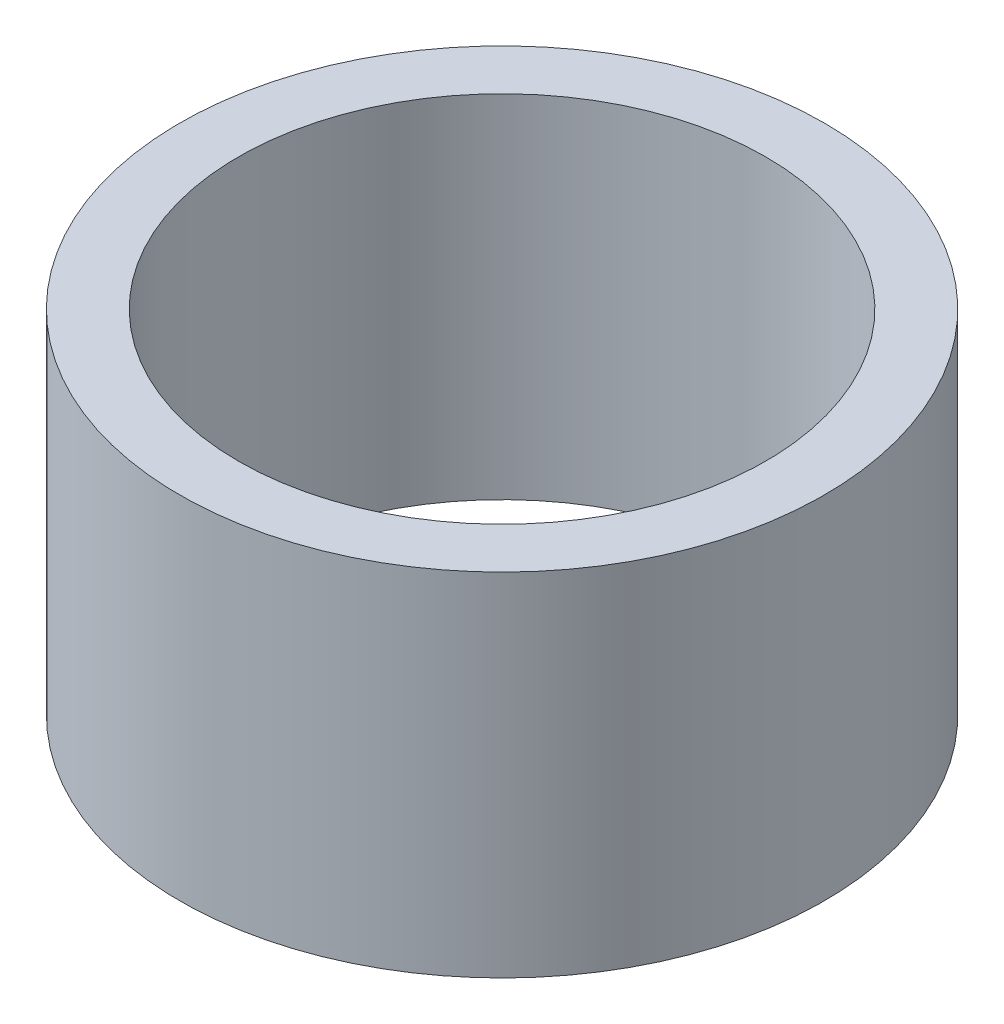
ISO-10303-21;
HEADER;
FILE_DESCRIPTION(('STEP AP214'),'2;1');
FILE_NAME('part.step','',(''),(''),'','','');
FILE_SCHEMA(('AUTOMOTIVE_DESIGN { 1 0 10303 214 1 1 1 1 }'));
ENDSEC;
DATA;
#1=APPLICATION_CONTEXT('core data for automotive mechanical design processes');
#2=APPLICATION_PROTOCOL_DEFINITION('international standard','automotive_design',2000,#1);
#3=PRODUCT_CONTEXT('',#1,'mechanical');
#4=PRODUCT('Part','Part','',(#3));
#5=PRODUCT_RELATED_PRODUCT_CATEGORY('part','',(#4));
#6=PRODUCT_DEFINITION_FORMATION('','',#4);
#7=PRODUCT_DEFINITION_CONTEXT('part definition',#1,'design');
#8=PRODUCT_DEFINITION('design','',#6,#7);
#9=PRODUCT_DEFINITION_SHAPE('','',#8);
#10=(LENGTH_UNIT() NAMED_UNIT(*) SI_UNIT(.MILLI.,.METRE.));
#11=(NAMED_UNIT(*) PLANE_ANGLE_UNIT() SI_UNIT($,.RADIAN.));
#12=(NAMED_UNIT(*) SI_UNIT($,.STERADIAN.) SOLID_ANGLE_UNIT());
#13=UNCERTAINTY_MEASURE_WITH_UNIT(LENGTH_MEASURE(1.E-05),#10,'distance_accuracy_value','');
#14=(GEOMETRIC_REPRESENTATION_CONTEXT(3) GLOBAL_UNCERTAINTY_ASSIGNED_CONTEXT((#13)) GLOBAL_UNIT_ASSIGNED_CONTEXT((#10,
#11,#12)) REPRESENTATION_CONTEXT('',''));
#15=CARTESIAN_POINT('',(0.,0.,0.));
#16=DIRECTION('',(0.,0.,1.));
#17=DIRECTION('',(1.,0.,0.));
#18=AXIS2_PLACEMENT_3D('',#15,#16,#17);
#19=CARTESIAN_POINT('',(0.,19.05,0.));
#20=DIRECTION('',(0.,1.,0.));
#21=DIRECTION('',(0.,0.,1.));
#22=AXIS2_PLACEMENT_3D('',#19,#20,#21);
#23=PLANE('',#22);
#24=CARTESIAN_POINT('',(0.,19.05,0.));
#25=DIRECTION('',(0.,1.,0.));
#26=DIRECTION('',(0.,0.,1.));
#27=AXIS2_PLACEMENT_3D('',#24,#25,#26);
#28=CIRCLE('',#27,17.4625);
#29=CARTESIAN_POINT('',(0.,19.05,-17.4625));
#30=VERTEX_POINT('',#29);
#31=EDGE_CURVE('E10',#30,#30,#28,.T.);
#32=ORIENTED_EDGE('',*,*,#31,.T.);
#33=EDGE_LOOP('',(#32));
#34=FACE_BOUND('',#33,.T.);
#35=CARTESIAN_POINT('',(0.,19.05,0.));
#36=DIRECTION('',(0.,1.,0.));
#37=DIRECTION('',(0.,0.,1.));
#38=AXIS2_PLACEMENT_3D('',#35,#36,#37);
#39=CIRCLE('',#38,14.2875);
#40=CARTESIAN_POINT('',(0.,19.05,-14.2875));
#41=VERTEX_POINT('',#40);
#42=EDGE_CURVE('E56',#41,#41,#39,.T.);
#43=ORIENTED_EDGE('',*,*,#42,.F.);
#44=EDGE_LOOP('',(#43));
#45=FACE_BOUND('',#44,.T.);
#46=ADVANCED_FACE('F43',(#34,#45),#23,.T.);
#47=CARTESIAN_POINT('',(0.,0.,0.));
#48=DIRECTION('',(0.,1.,0.));
#49=DIRECTION('',(0.,0.,1.));
#50=AXIS2_PLACEMENT_3D('',#47,#48,#49);
#51=PLANE('',#50);
#52=CARTESIAN_POINT('',(0.,0.,0.));
#53=DIRECTION('',(0.,1.,0.));
#54=DIRECTION('',(0.,0.,1.));
#55=AXIS2_PLACEMENT_3D('',#52,#53,#54);
#56=CIRCLE('',#55,17.4625);
#57=CARTESIAN_POINT('',(0.,0.,-17.4625));
#58=VERTEX_POINT('',#57);
#59=EDGE_CURVE('E47',#58,#58,#56,.T.);
#60=ORIENTED_EDGE('',*,*,#59,.F.);
#61=EDGE_LOOP('',(#60));
#62=FACE_BOUND('',#61,.T.);
#63=CARTESIAN_POINT('',(0.,0.,0.));
#64=DIRECTION('',(0.,1.,0.));
#65=DIRECTION('',(0.,0.,1.));
#66=AXIS2_PLACEMENT_3D('',#63,#64,#65);
#67=CIRCLE('',#66,14.2875);
#68=CARTESIAN_POINT('',(0.,0.,-14.2875));
#69=VERTEX_POINT('',#68);
#70=EDGE_CURVE('E58',#69,#69,#67,.T.);
#71=ORIENTED_EDGE('',*,*,#70,.T.);
#72=EDGE_LOOP('',(#71));
#73=FACE_BOUND('',#72,.T.);
#74=ADVANCED_FACE('F70',(#62,#73),#51,.F.);
#75=CARTESIAN_POINT('',(0.,19.05,0.));
#76=DIRECTION('',(0.,-1.,0.));
#77=DIRECTION('',(0.,0.,-1.));
#78=AXIS2_PLACEMENT_3D('',#75,#76,#77);
#79=CYLINDRICAL_SURFACE('',#78,17.4625);
#80=CARTESIAN_POINT('',(0.,19.05,-17.4625));
#81=CARTESIAN_POINT('',(0.,18.8515625,-17.4625));
#82=CARTESIAN_POINT('',(0.,18.653125,-17.4625));
#83=CARTESIAN_POINT('',(0.,18.25625,-17.4625));
#84=CARTESIAN_POINT('',(0.,18.0578125,-17.4625));
#85=CARTESIAN_POINT('',(0.,17.6609375,-17.4625));
#86=CARTESIAN_POINT('',(0.,17.4625,-17.4625));
#87=CARTESIAN_POINT('',(0.,17.065625,-17.4625));
#88=CARTESIAN_POINT('',(0.,16.8671875,-17.4625));
#89=CARTESIAN_POINT('',(0.,16.4703125,-17.4625));
#90=CARTESIAN_POINT('',(0.,16.271875,-17.4625));
#91=CARTESIAN_POINT('',(0.,15.875,-17.4625));
#92=CARTESIAN_POINT('',(0.,15.6765625,-17.4625));
#93=CARTESIAN_POINT('',(0.,15.2796875,-17.4625));
#94=CARTESIAN_POINT('',(0.,15.08125,-17.4625));
#95=CARTESIAN_POINT('',(0.,14.684375,-17.4625));
#96=CARTESIAN_POINT('',(0.,14.4859375,-17.4625));
#97=CARTESIAN_POINT('',(0.,14.0890625,-17.4625));
#98=CARTESIAN_POINT('',(0.,13.890625,-17.4625));
#99=CARTESIAN_POINT('',(0.,13.49375,-17.4625));
#100=CARTESIAN_POINT('',(0.,13.2953125,-17.4625));
#101=CARTESIAN_POINT('',(0.,12.8984375,-17.4625));
#102=CARTESIAN_POINT('',(0.,12.7,-17.4625));
#103=CARTESIAN_POINT('',(0.,12.303125,-17.4625));
#104=CARTESIAN_POINT('',(0.,12.1046875,-17.4625));
#105=CARTESIAN_POINT('',(0.,11.7078125,-17.4625));
#106=CARTESIAN_POINT('',(0.,11.509375,-17.4625));
#107=CARTESIAN_POINT('',(0.,11.1125,-17.4625));
#108=CARTESIAN_POINT('',(0.,10.9140625,-17.4625));
#109=CARTESIAN_POINT('',(0.,10.5171875,-17.4625));
#110=CARTESIAN_POINT('',(0.,10.31875,-17.4625));
#111=CARTESIAN_POINT('',(0.,9.921875,-17.4625));
#112=CARTESIAN_POINT('',(0.,9.7234375,-17.4625));
#113=CARTESIAN_POINT('',(0.,9.3265625,-17.4625));
#114=CARTESIAN_POINT('',(0.,9.128125,-17.4625));
#115=CARTESIAN_POINT('',(0.,8.73125,-17.4625));
#116=CARTESIAN_POINT('',(0.,8.5328125,-17.4625));
#117=CARTESIAN_POINT('',(0.,8.1359375,-17.4625));
#118=CARTESIAN_POINT('',(0.,7.9375,-17.4625));
#119=CARTESIAN_POINT('',(0.,7.540625,-17.4625));
#120=CARTESIAN_POINT('',(0.,7.3421875,-17.4625));
#121=CARTESIAN_POINT('',(0.,6.9453125,-17.4625));
#122=CARTESIAN_POINT('',(0.,6.746875,-17.4625));
#123=CARTESIAN_POINT('',(0.,6.35,-17.4625));
#124=CARTESIAN_POINT('',(0.,6.1515625,-17.4625));
#125=CARTESIAN_POINT('',(0.,5.7546875,-17.4625));
#126=CARTESIAN_POINT('',(0.,5.55625,-17.4625));
#127=CARTESIAN_POINT('',(0.,5.159375,-17.4625));
#128=CARTESIAN_POINT('',(0.,4.9609375,-17.4625));
#129=CARTESIAN_POINT('',(0.,4.5640625,-17.4625));
#130=CARTESIAN_POINT('',(0.,4.365625,-17.4625));
#131=CARTESIAN_POINT('',(0.,3.96875,-17.4625));
#132=CARTESIAN_POINT('',(0.,3.7703125,-17.4625));
#133=CARTESIAN_POINT('',(0.,3.3734375,-17.4625));
#134=CARTESIAN_POINT('',(0.,3.175,-17.4625));
#135=CARTESIAN_POINT('',(0.,2.778125,-17.4625));
#136=CARTESIAN_POINT('',(0.,2.5796875,-17.4625));
#137=CARTESIAN_POINT('',(0.,2.1828125,-17.4625));
#138=CARTESIAN_POINT('',(0.,1.984375,-17.4625));
#139=CARTESIAN_POINT('',(0.,1.5875,-17.4625));
#140=CARTESIAN_POINT('',(0.,1.3890625,-17.4625));
#141=CARTESIAN_POINT('',(0.,0.992187500000001,-17.4625));
#142=CARTESIAN_POINT('',(0.,0.793750000000001,-17.4625));
#143=CARTESIAN_POINT('',(0.,0.396875,-17.4625));
#144=CARTESIAN_POINT('',(0.,0.1984375,-17.4625));
#145=CARTESIAN_POINT('',(0.,0.,-17.4625));
#146=B_SPLINE_CURVE_WITH_KNOTS('',3,(#80,#81,#82,#83,#84,#85,#86,#87,#88,#89,#90,#91,#92,#93,
#94,#95,#96,#97,#98,#99,#100,#101,#102,#103,#104,#105,#106,#107,#108,#109,#110,#111,#112,#113,
#114,#115,#116,#117,#118,#119,#120,#121,#122,#123,#124,#125,#126,#127,#128,#129,#130,#131,#132,
#133,#134,#135,#136,#137,#138,#139,#140,#141,#142,#143,#144,#145),.UNSPECIFIED.,.F.,.F.,(4,2,2,
2,2,2,2,2,2,2,2,2,2,2,2,2,2,2,2,2,2,2,2,2,2,2,2,2,2,2,2,2,4),(0.,0.595312499999997,1.190625,
1.7859375,2.38125,2.9765625,3.571875,4.1671875,4.7625,5.3578125,5.953125,6.5484375,7.14375,
7.7390625,8.334375,8.9296875,9.525,10.1203125,10.715625,11.3109375,11.90625,12.5015625,
13.096875,13.6921875,14.2875,14.8828125,15.478125,16.0734375,16.66875,17.2640625,17.859375,
18.4546875,19.05),.UNSPECIFIED.);
#147=EDGE_CURVE('BSEAM45',#30,#58,#146,.T.);
#148=ORIENTED_EDGE('',*,*,#31,.F.);
#149=ORIENTED_EDGE('',*,*,#59,.T.);
#150=ORIENTED_EDGE('',*,*,#147,.T.);
#151=ORIENTED_EDGE('',*,*,#147,.F.);
#152=EDGE_LOOP('',(#148,#150,#149,#151));
#153=FACE_BOUND('',#152,.T.);
#154=ADVANCED_FACE('F45',(#153),#79,.T.);
#155=CARTESIAN_POINT('',(0.,19.05,0.));
#156=DIRECTION('',(0.,-1.,0.));
#157=DIRECTION('',(0.,0.,-1.));
#158=AXIS2_PLACEMENT_3D('',#155,#156,#157);
#159=CYLINDRICAL_SURFACE('',#158,14.2875);
#160=CARTESIAN_POINT('',(0.,19.05,-14.2875));
#161=CARTESIAN_POINT('',(0.,18.8515625,-14.2875));
#162=CARTESIAN_POINT('',(0.,18.653125,-14.2875));
#163=CARTESIAN_POINT('',(0.,18.25625,-14.2875));
#164=CARTESIAN_POINT('',(0.,18.0578125,-14.2875));
#165=CARTESIAN_POINT('',(0.,17.6609375,-14.2875));
#166=CARTESIAN_POINT('',(0.,17.4625,-14.2875));
#167=CARTESIAN_POINT('',(0.,17.065625,-14.2875));
#168=CARTESIAN_POINT('',(0.,16.8671875,-14.2875));
#169=CARTESIAN_POINT('',(0.,16.4703125,-14.2875));
#170=CARTESIAN_POINT('',(0.,16.271875,-14.2875));
#171=CARTESIAN_POINT('',(0.,15.875,-14.2875));
#172=CARTESIAN_POINT('',(0.,15.6765625,-14.2875));
#173=CARTESIAN_POINT('',(0.,15.2796875,-14.2875));
#174=CARTESIAN_POINT('',(0.,15.08125,-14.2875));
#175=CARTESIAN_POINT('',(0.,14.684375,-14.2875));
#176=CARTESIAN_POINT('',(0.,14.4859375,-14.2875));
#177=CARTESIAN_POINT('',(0.,14.0890625,-14.2875));
#178=CARTESIAN_POINT('',(0.,13.890625,-14.2875));
#179=CARTESIAN_POINT('',(0.,13.49375,-14.2875));
#180=CARTESIAN_POINT('',(0.,13.2953125,-14.2875));
#181=CARTESIAN_POINT('',(0.,12.8984375,-14.2875));
#182=CARTESIAN_POINT('',(0.,12.7,-14.2875));
#183=CARTESIAN_POINT('',(0.,12.303125,-14.2875));
#184=CARTESIAN_POINT('',(0.,12.1046875,-14.2875));
#185=CARTESIAN_POINT('',(0.,11.7078125,-14.2875));
#186=CARTESIAN_POINT('',(0.,11.509375,-14.2875));
#187=CARTESIAN_POINT('',(0.,11.1125,-14.2875));
#188=CARTESIAN_POINT('',(0.,10.9140625,-14.2875));
#189=CARTESIAN_POINT('',(0.,10.5171875,-14.2875));
#190=CARTESIAN_POINT('',(0.,10.31875,-14.2875));
#191=CARTESIAN_POINT('',(0.,9.921875,-14.2875));
#192=CARTESIAN_POINT('',(0.,9.7234375,-14.2875));
#193=CARTESIAN_POINT('',(0.,9.3265625,-14.2875));
#194=CARTESIAN_POINT('',(0.,9.128125,-14.2875));
#195=CARTESIAN_POINT('',(0.,8.73125,-14.2875));
#196=CARTESIAN_POINT('',(0.,8.5328125,-14.2875));
#197=CARTESIAN_POINT('',(0.,8.1359375,-14.2875));
#198=CARTESIAN_POINT('',(0.,7.9375,-14.2875));
#199=CARTESIAN_POINT('',(0.,7.540625,-14.2875));
#200=CARTESIAN_POINT('',(0.,7.3421875,-14.2875));
#201=CARTESIAN_POINT('',(0.,6.9453125,-14.2875));
#202=CARTESIAN_POINT('',(0.,6.746875,-14.2875));
#203=CARTESIAN_POINT('',(0.,6.35,-14.2875));
#204=CARTESIAN_POINT('',(0.,6.1515625,-14.2875));
#205=CARTESIAN_POINT('',(0.,5.7546875,-14.2875));
#206=CARTESIAN_POINT('',(0.,5.55625,-14.2875));
#207=CARTESIAN_POINT('',(0.,5.159375,-14.2875));
#208=CARTESIAN_POINT('',(0.,4.9609375,-14.2875));
#209=CARTESIAN_POINT('',(0.,4.5640625,-14.2875));
#210=CARTESIAN_POINT('',(0.,4.365625,-14.2875));
#211=CARTESIAN_POINT('',(0.,3.96875,-14.2875));
#212=CARTESIAN_POINT('',(0.,3.7703125,-14.2875));
#213=CARTESIAN_POINT('',(0.,3.3734375,-14.2875));
#214=CARTESIAN_POINT('',(0.,3.175,-14.2875));
#215=CARTESIAN_POINT('',(0.,2.778125,-14.2875));
#216=CARTESIAN_POINT('',(0.,2.5796875,-14.2875));
#217=CARTESIAN_POINT('',(0.,2.1828125,-14.2875));
#218=CARTESIAN_POINT('',(0.,1.984375,-14.2875));
#219=CARTESIAN_POINT('',(0.,1.5875,-14.2875));
#220=CARTESIAN_POINT('',(0.,1.3890625,-14.2875));
#221=CARTESIAN_POINT('',(0.,0.992187500000001,-14.2875));
#222=CARTESIAN_POINT('',(0.,0.793750000000001,-14.2875));
#223=CARTESIAN_POINT('',(0.,0.396875,-14.2875));
#224=CARTESIAN_POINT('',(0.,0.1984375,-14.2875));
#225=CARTESIAN_POINT('',(0.,0.,-14.2875));
#226=B_SPLINE_CURVE_WITH_KNOTS('',3,(#160,#161,#162,#163,#164,#165,#166,#167,#168,#169,#170,
#171,#172,#173,#174,#175,#176,#177,#178,#179,#180,#181,#182,#183,#184,#185,#186,#187,#188,#189,
#190,#191,#192,#193,#194,#195,#196,#197,#198,#199,#200,#201,#202,#203,#204,#205,#206,#207,#208,
#209,#210,#211,#212,#213,#214,#215,#216,#217,#218,#219,#220,#221,#222,#223,#224,#225),
.UNSPECIFIED.,.F.,.F.,(4,2,2,2,2,2,2,2,2,2,2,2,2,2,2,2,2,2,2,2,2,2,2,2,2,2,2,2,2,2,2,2,4),(0.,
0.5953125,1.190625,1.7859375,2.38125,2.9765625,3.571875,4.1671875,4.7625,5.3578125,5.953125,
6.5484375,7.14375,7.7390625,8.334375,8.9296875,9.525,10.1203125,10.715625,11.3109375,11.90625,
12.5015625,13.096875,13.6921875,14.2875,14.8828125,15.478125,16.0734375,16.66875,17.2640625,
17.859375,18.4546875,19.05),.UNSPECIFIED.);
#227=EDGE_CURVE('BSEAM66',#41,#69,#226,.T.);
#228=ORIENTED_EDGE('',*,*,#42,.T.);
#229=ORIENTED_EDGE('',*,*,#70,.F.);
#230=ORIENTED_EDGE('',*,*,#227,.T.);
#231=ORIENTED_EDGE('',*,*,#227,.F.);
#232=EDGE_LOOP('',(#228,#230,#229,#231));
#233=FACE_BOUND('',#232,.T.);
#234=ADVANCED_FACE('F66',(#233),#159,.F.);
#235=CLOSED_SHELL('',(#46,#74,#154,#234));
#236=MANIFOLD_SOLID_BREP('B2',#235);
#237=ADVANCED_BREP_SHAPE_REPRESENTATION('',(#18,#236),#14);
#238=SHAPE_DEFINITION_REPRESENTATION(#9,#237);
ENDSEC;
END-ISO-10303-21;
